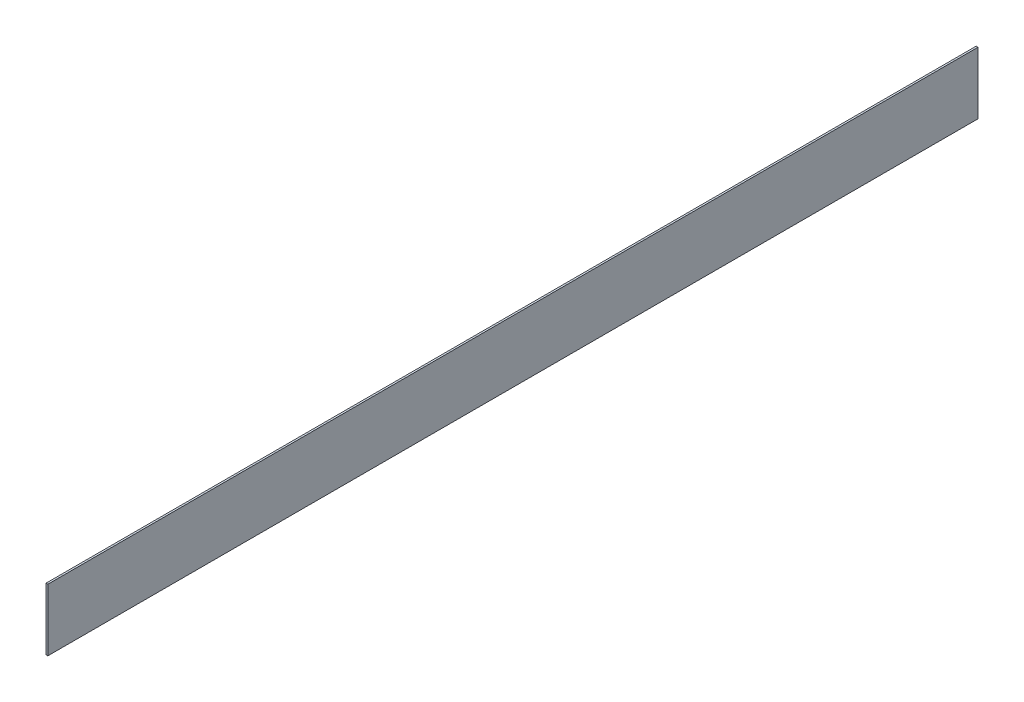
ISO-10303-21;
HEADER;
FILE_DESCRIPTION(('STEP AP214'),'2;1');
FILE_NAME('part.step','',(''),(''),'','','');
FILE_SCHEMA(('AUTOMOTIVE_DESIGN { 1 0 10303 214 1 1 1 1 }'));
ENDSEC;
DATA;
#1=APPLICATION_CONTEXT('core data for automotive mechanical design processes');
#2=APPLICATION_PROTOCOL_DEFINITION('international standard','automotive_design',2000,#1);
#3=PRODUCT_CONTEXT('',#1,'mechanical');
#4=PRODUCT('Part','Part','',(#3));
#5=PRODUCT_RELATED_PRODUCT_CATEGORY('part','',(#4));
#6=PRODUCT_DEFINITION_FORMATION('','',#4);
#7=PRODUCT_DEFINITION_CONTEXT('part definition',#1,'design');
#8=PRODUCT_DEFINITION('design','',#6,#7);
#9=PRODUCT_DEFINITION_SHAPE('','',#8);
#10=(LENGTH_UNIT() NAMED_UNIT(*) SI_UNIT(.MILLI.,.METRE.));
#11=(NAMED_UNIT(*) PLANE_ANGLE_UNIT() SI_UNIT($,.RADIAN.));
#12=(NAMED_UNIT(*) SI_UNIT($,.STERADIAN.) SOLID_ANGLE_UNIT());
#13=UNCERTAINTY_MEASURE_WITH_UNIT(LENGTH_MEASURE(1.E-05),#10,'distance_accuracy_value','');
#14=(GEOMETRIC_REPRESENTATION_CONTEXT(3) GLOBAL_UNCERTAINTY_ASSIGNED_CONTEXT((#13)) GLOBAL_UNIT_ASSIGNED_CONTEXT((#10,
#11,#12)) REPRESENTATION_CONTEXT('',''));
#15=CARTESIAN_POINT('',(0.,0.,0.));
#16=DIRECTION('',(0.,0.,1.));
#17=DIRECTION('',(1.,0.,0.));
#18=AXIS2_PLACEMENT_3D('',#15,#16,#17);
#19=CARTESIAN_POINT('',(5.99999999999998,200.,3000.));
#20=DIRECTION('',(-1.,0.,0.));
#21=DIRECTION('',(0.,-1.,0.));
#22=AXIS2_PLACEMENT_3D('',#19,#20,#21);
#23=PLANE('',#22);
#24=DIRECTION('',(0.,1.,0.));
#25=VECTOR('',#24,1.);
#26=CARTESIAN_POINT('',(5.99999999999998,200.,-3000.));
#27=LINE('',#26,#25);
#28=CARTESIAN_POINT('',(6.00000000000003,-200.,-3000.));
#29=VERTEX_POINT('',#28);
#30=CARTESIAN_POINT('',(5.99999999999998,200.,-3000.));
#31=VERTEX_POINT('',#30);
#32=EDGE_CURVE('E97',#29,#31,#27,.T.);
#33=ORIENTED_EDGE('',*,*,#32,.T.);
#34=DIRECTION('',(0.,0.,-1.));
#35=VECTOR('',#34,1.);
#36=CARTESIAN_POINT('',(5.99999999999998,200.,3000.));
#37=LINE('',#36,#35);
#38=CARTESIAN_POINT('',(5.99999999999998,200.,3000.));
#39=VERTEX_POINT('',#38);
#40=EDGE_CURVE('E11',#39,#31,#37,.T.);
#41=ORIENTED_EDGE('',*,*,#40,.F.);
#42=DIRECTION('',(0.,1.,0.));
#43=VECTOR('',#42,1.);
#44=CARTESIAN_POINT('',(5.99999999999998,200.,3000.));
#45=LINE('',#44,#43);
#46=CARTESIAN_POINT('',(6.00000000000003,-200.,3000.));
#47=VERTEX_POINT('',#46);
#48=EDGE_CURVE('E85',#47,#39,#45,.T.);
#49=ORIENTED_EDGE('',*,*,#48,.F.);
#50=DIRECTION('',(0.,0.,-1.));
#51=VECTOR('',#50,1.);
#52=CARTESIAN_POINT('',(6.00000000000003,-200.,3000.));
#53=LINE('',#52,#51);
#54=EDGE_CURVE('E93',#47,#29,#53,.T.);
#55=ORIENTED_EDGE('',*,*,#54,.T.);
#56=EDGE_LOOP('',(#33,#41,#49,#55));
#57=FACE_BOUND('',#56,.T.);
#58=ADVANCED_FACE('F34',(#57),#23,.F.);
#59=CARTESIAN_POINT('',(-6.00000000000002,200.,3000.));
#60=DIRECTION('',(0.,-1.,0.));
#61=DIRECTION('',(0.,0.,-1.));
#62=AXIS2_PLACEMENT_3D('',#59,#60,#61);
#63=PLANE('',#62);
#64=DIRECTION('',(-1.,0.,0.));
#65=VECTOR('',#64,1.);
#66=CARTESIAN_POINT('',(-6.00000000000002,200.,-3000.));
#67=LINE('',#66,#65);
#68=CARTESIAN_POINT('',(-6.00000000000002,200.,-3000.));
#69=VERTEX_POINT('',#68);
#70=EDGE_CURVE('E89',#31,#69,#67,.T.);
#71=ORIENTED_EDGE('',*,*,#70,.T.);
#72=DIRECTION('',(0.,0.,-1.));
#73=VECTOR('',#72,1.);
#74=CARTESIAN_POINT('',(-6.00000000000002,200.,3000.));
#75=LINE('',#74,#73);
#76=CARTESIAN_POINT('',(-6.00000000000002,200.,3000.));
#77=VERTEX_POINT('',#76);
#78=EDGE_CURVE('E42',#77,#69,#75,.T.);
#79=ORIENTED_EDGE('',*,*,#78,.F.);
#80=DIRECTION('',(-1.,0.,0.));
#81=VECTOR('',#80,1.);
#82=CARTESIAN_POINT('',(-6.00000000000002,200.,3000.));
#83=LINE('',#82,#81);
#84=EDGE_CURVE('E80',#39,#77,#83,.T.);
#85=ORIENTED_EDGE('',*,*,#84,.F.);
#86=ORIENTED_EDGE('',*,*,#40,.T.);
#87=EDGE_LOOP('',(#71,#79,#85,#86));
#88=FACE_BOUND('',#87,.T.);
#89=ADVANCED_FACE('F88',(#88),#63,.F.);
#90=CARTESIAN_POINT('',(-6.00000000000002,200.,3000.));
#91=DIRECTION('',(1.,0.,0.));
#92=DIRECTION('',(0.,1.,0.));
#93=AXIS2_PLACEMENT_3D('',#90,#91,#92);
#94=PLANE('',#93);
#95=DIRECTION('',(0.,-1.,0.));
#96=VECTOR('',#95,1.);
#97=CARTESIAN_POINT('',(-6.00000000000002,200.,-3000.));
#98=LINE('',#97,#96);
#99=CARTESIAN_POINT('',(-5.99999999999997,-200.,-3000.));
#100=VERTEX_POINT('',#99);
#101=EDGE_CURVE('E67',#69,#100,#98,.T.);
#102=ORIENTED_EDGE('',*,*,#101,.T.);
#103=DIRECTION('',(0.,0.,-1.));
#104=VECTOR('',#103,1.);
#105=CARTESIAN_POINT('',(-5.99999999999997,-200.,3000.));
#106=LINE('',#105,#104);
#107=CARTESIAN_POINT('',(-5.99999999999997,-200.,3000.));
#108=VERTEX_POINT('',#107);
#109=EDGE_CURVE('E90',#108,#100,#106,.T.);
#110=ORIENTED_EDGE('',*,*,#109,.F.);
#111=DIRECTION('',(0.,-1.,0.));
#112=VECTOR('',#111,1.);
#113=CARTESIAN_POINT('',(-6.00000000000002,200.,3000.));
#114=LINE('',#113,#112);
#115=EDGE_CURVE('E83',#77,#108,#114,.T.);
#116=ORIENTED_EDGE('',*,*,#115,.F.);
#117=ORIENTED_EDGE('',*,*,#78,.T.);
#118=EDGE_LOOP('',(#102,#110,#116,#117));
#119=FACE_BOUND('',#118,.T.);
#120=ADVANCED_FACE('F91',(#119),#94,.F.);
#121=CARTESIAN_POINT('',(-5.99999999999997,-200.,3000.));
#122=DIRECTION('',(0.,1.,0.));
#123=DIRECTION('',(0.,0.,1.));
#124=AXIS2_PLACEMENT_3D('',#121,#122,#123);
#125=PLANE('',#124);
#126=DIRECTION('',(1.,0.,0.));
#127=VECTOR('',#126,1.);
#128=CARTESIAN_POINT('',(-5.99999999999997,-200.,-3000.));
#129=LINE('',#128,#127);
#130=EDGE_CURVE('E73',#100,#29,#129,.T.);
#131=ORIENTED_EDGE('',*,*,#130,.T.);
#132=ORIENTED_EDGE('',*,*,#54,.F.);
#133=DIRECTION('',(1.,0.,0.));
#134=VECTOR('',#133,1.);
#135=CARTESIAN_POINT('',(-5.99999999999997,-200.,3000.));
#136=LINE('',#135,#134);
#137=EDGE_CURVE('E50',#108,#47,#136,.T.);
#138=ORIENTED_EDGE('',*,*,#137,.F.);
#139=ORIENTED_EDGE('',*,*,#109,.T.);
#140=EDGE_LOOP('',(#131,#132,#138,#139));
#141=FACE_BOUND('',#140,.T.);
#142=ADVANCED_FACE('F104',(#141),#125,.F.);
#143=CARTESIAN_POINT('',(0.,0.,3000.));
#144=DIRECTION('',(0.,0.,1.));
#145=DIRECTION('',(1.,0.,0.));
#146=AXIS2_PLACEMENT_3D('',#143,#144,#145);
#147=PLANE('',#146);
#148=ORIENTED_EDGE('',*,*,#48,.T.);
#149=ORIENTED_EDGE('',*,*,#84,.T.);
#150=ORIENTED_EDGE('',*,*,#115,.T.);
#151=ORIENTED_EDGE('',*,*,#137,.T.);
#152=EDGE_LOOP('',(#148,#149,#150,#151));
#153=FACE_BOUND('',#152,.T.);
#154=ADVANCED_FACE('F81',(#153),#147,.T.);
#155=CARTESIAN_POINT('',(0.,0.,-3000.));
#156=DIRECTION('',(0.,0.,1.));
#157=DIRECTION('',(1.,0.,0.));
#158=AXIS2_PLACEMENT_3D('',#155,#156,#157);
#159=PLANE('',#158);
#160=ORIENTED_EDGE('',*,*,#32,.F.);
#161=ORIENTED_EDGE('',*,*,#130,.F.);
#162=ORIENTED_EDGE('',*,*,#101,.F.);
#163=ORIENTED_EDGE('',*,*,#70,.F.);
#164=EDGE_LOOP('',(#160,#161,#162,#163));
#165=FACE_BOUND('',#164,.T.);
#166=ADVANCED_FACE('F107',(#165),#159,.F.);
#167=CLOSED_SHELL('',(#58,#89,#120,#142,#154,#166));
#168=MANIFOLD_SOLID_BREP('B2',#167);
#169=ADVANCED_BREP_SHAPE_REPRESENTATION('',(#18,#168),#14);
#170=SHAPE_DEFINITION_REPRESENTATION(#9,#169);
ENDSEC;
END-ISO-10303-21;
